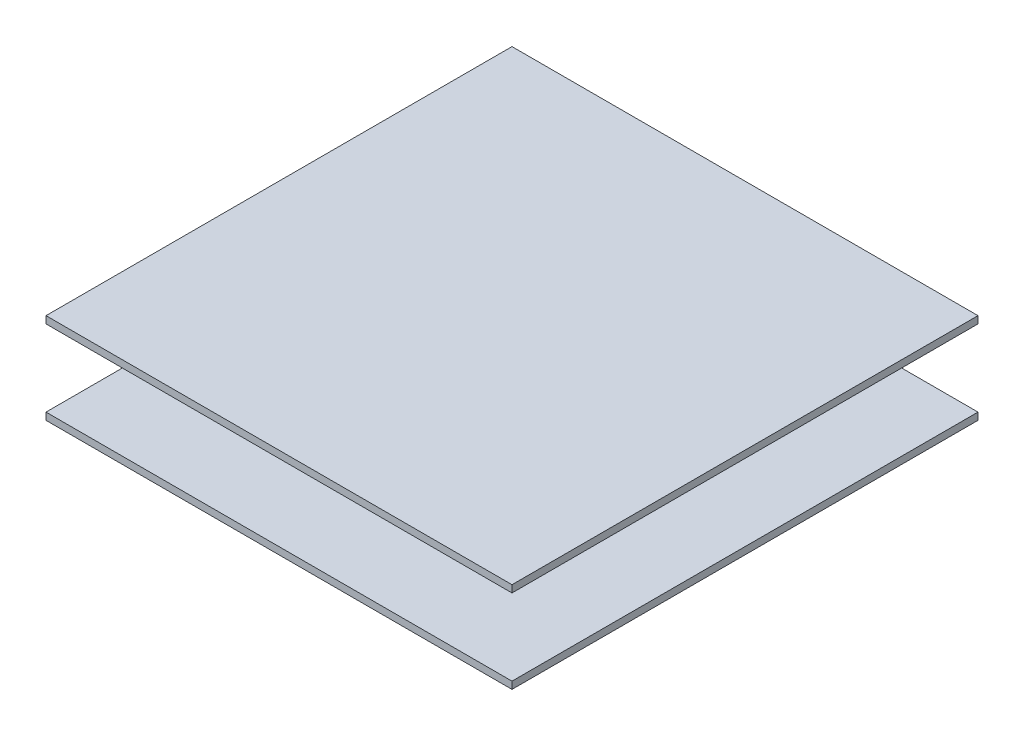
ISO-10303-21;
HEADER;
FILE_DESCRIPTION(('STEP AP214'),'2;1');
FILE_NAME('part.step','',(''),(''),'','','');
FILE_SCHEMA(('AUTOMOTIVE_DESIGN { 1 0 10303 214 1 1 1 1 }'));
ENDSEC;
DATA;
#1=APPLICATION_CONTEXT('core data for automotive mechanical design processes');
#2=APPLICATION_PROTOCOL_DEFINITION('international standard','automotive_design',2000,#1);
#3=PRODUCT_CONTEXT('',#1,'mechanical');
#4=PRODUCT('Part','Part','',(#3));
#5=PRODUCT_RELATED_PRODUCT_CATEGORY('part','',(#4));
#6=PRODUCT_DEFINITION_FORMATION('','',#4);
#7=PRODUCT_DEFINITION_CONTEXT('part definition',#1,'design');
#8=PRODUCT_DEFINITION('design','',#6,#7);
#9=PRODUCT_DEFINITION_SHAPE('','',#8);
#10=(LENGTH_UNIT() NAMED_UNIT(*) SI_UNIT(.MILLI.,.METRE.));
#11=(NAMED_UNIT(*) PLANE_ANGLE_UNIT() SI_UNIT($,.RADIAN.));
#12=(NAMED_UNIT(*) SI_UNIT($,.STERADIAN.) SOLID_ANGLE_UNIT());
#13=UNCERTAINTY_MEASURE_WITH_UNIT(LENGTH_MEASURE(1.E-05),#10,'distance_accuracy_value','');
#14=(GEOMETRIC_REPRESENTATION_CONTEXT(3) GLOBAL_UNCERTAINTY_ASSIGNED_CONTEXT((#13)) GLOBAL_UNIT_ASSIGNED_CONTEXT((#10,
#11,#12)) REPRESENTATION_CONTEXT('',''));
#15=CARTESIAN_POINT('',(0.,0.,0.));
#16=DIRECTION('',(0.,0.,1.));
#17=DIRECTION('',(1.,0.,0.));
#18=AXIS2_PLACEMENT_3D('',#15,#16,#17);
#19=CARTESIAN_POINT('',(0.,0.,80.));
#20=DIRECTION('',(1.,0.,0.));
#21=DIRECTION('',(0.,0.,-1.));
#22=AXIS2_PLACEMENT_3D('',#19,#20,#21);
#23=PLANE('',#22);
#24=CARTESIAN_POINT('',(0.,6.35,43.8));
#25=DIRECTION('',(-1.,0.,0.));
#26=DIRECTION('',(0.,0.,1.));
#27=AXIS2_PLACEMENT_3D('',#24,#25,#26);
#28=CIRCLE('',#27,5.25);
#29=CARTESIAN_POINT('',(0.,2.72750086266401,40.));
#30=VERTEX_POINT('',#29);
#31=CARTESIAN_POINT('',(0.,9.97249913733599,40.));
#32=VERTEX_POINT('',#31);
#33=EDGE_CURVE('E214',#30,#32,#28,.T.);
#34=ORIENTED_EDGE('',*,*,#33,.F.);
#35=CARTESIAN_POINT('',(0.,6.35,36.2));
#36=DIRECTION('',(-1.,0.,0.));
#37=DIRECTION('',(0.,0.,1.));
#38=AXIS2_PLACEMENT_3D('',#35,#36,#37);
#39=CIRCLE('',#38,5.25);
#40=EDGE_CURVE('E49',#32,#30,#39,.T.);
#41=ORIENTED_EDGE('',*,*,#40,.F.);
#42=EDGE_LOOP('',(#34,#41));
#43=FACE_BOUND('',#42,.T.);
#44=DIRECTION('',(0.,-1.,0.));
#45=VECTOR('',#44,1.);
#46=CARTESIAN_POINT('',(0.,0.,0.));
#47=LINE('',#46,#45);
#48=CARTESIAN_POINT('',(0.,12.7,0.));
#49=VERTEX_POINT('',#48);
#50=CARTESIAN_POINT('',(0.,0.,0.));
#51=VERTEX_POINT('',#50);
#52=EDGE_CURVE('E228',#49,#51,#47,.T.);
#53=ORIENTED_EDGE('',*,*,#52,.T.);
#54=DIRECTION('',(0.,0.,-1.));
#55=VECTOR('',#54,1.);
#56=CARTESIAN_POINT('',(0.,0.,80.));
#57=LINE('',#56,#55);
#58=CARTESIAN_POINT('',(0.,0.,80.));
#59=VERTEX_POINT('',#58);
#60=EDGE_CURVE('E11',#59,#51,#57,.T.);
#61=ORIENTED_EDGE('',*,*,#60,.F.);
#62=DIRECTION('',(0.,-1.,0.));
#63=VECTOR('',#62,1.);
#64=CARTESIAN_POINT('',(0.,0.,80.));
#65=LINE('',#64,#63);
#66=CARTESIAN_POINT('',(0.,12.7,80.));
#67=VERTEX_POINT('',#66);
#68=EDGE_CURVE('E231',#67,#59,#65,.T.);
#69=ORIENTED_EDGE('',*,*,#68,.F.);
#70=DIRECTION('',(0.,0.,-1.));
#71=VECTOR('',#70,1.);
#72=CARTESIAN_POINT('',(0.,12.7,80.));
#73=LINE('',#72,#71);
#74=EDGE_CURVE('E241',#67,#49,#73,.T.);
#75=ORIENTED_EDGE('',*,*,#74,.T.);
#76=EDGE_LOOP('',(#53,#61,#69,#75));
#77=FACE_BOUND('',#76,.T.);
#78=ADVANCED_FACE('F35',(#43,#77),#23,.F.);
#79=CARTESIAN_POINT('',(0.,0.,80.));
#80=DIRECTION('',(0.,1.,0.));
#81=DIRECTION('',(0.,0.,1.));
#82=AXIS2_PLACEMENT_3D('',#79,#80,#81);
#83=PLANE('',#82);
#84=CARTESIAN_POINT('',(6.6687205362473,0.,60.));
#85=DIRECTION('',(0.,1.,0.));
#86=DIRECTION('',(0.,0.,1.));
#87=AXIS2_PLACEMENT_3D('',#84,#85,#86);
#88=CIRCLE('',#87,2.);
#89=CARTESIAN_POINT('',(6.6687205362473,0.,62.));
#90=VERTEX_POINT('',#89);
#91=EDGE_CURVE('E197',#90,#90,#88,.T.);
#92=ORIENTED_EDGE('',*,*,#91,.T.);
#93=EDGE_LOOP('',(#92));
#94=FACE_BOUND('',#93,.T.);
#95=CARTESIAN_POINT('',(6.6687205362473,0.,75.));
#96=DIRECTION('',(0.,1.,0.));
#97=DIRECTION('',(0.,0.,1.));
#98=AXIS2_PLACEMENT_3D('',#95,#96,#97);
#99=CIRCLE('',#98,2.);
#100=CARTESIAN_POINT('',(6.6687205362473,0.,77.));
#101=VERTEX_POINT('',#100);
#102=EDGE_CURVE('E201',#101,#101,#99,.T.);
#103=ORIENTED_EDGE('',*,*,#102,.T.);
#104=EDGE_LOOP('',(#103));
#105=FACE_BOUND('',#104,.T.);
#106=DIRECTION('',(1.,0.,0.));
#107=VECTOR('',#106,1.);
#108=CARTESIAN_POINT('',(0.,0.,0.));
#109=LINE('',#108,#107);
#110=CARTESIAN_POINT('',(12.7,0.,0.));
#111=VERTEX_POINT('',#110);
#112=EDGE_CURVE('E244',#51,#111,#109,.T.);
#113=ORIENTED_EDGE('',*,*,#112,.T.);
#114=DIRECTION('',(0.,0.,-1.));
#115=VECTOR('',#114,1.);
#116=CARTESIAN_POINT('',(12.7,0.,80.));
#117=LINE('',#116,#115);
#118=CARTESIAN_POINT('',(12.7,0.,80.));
#119=VERTEX_POINT('',#118);
#120=EDGE_CURVE('E42',#119,#111,#117,.T.);
#121=ORIENTED_EDGE('',*,*,#120,.F.);
#122=DIRECTION('',(1.,0.,0.));
#123=VECTOR('',#122,1.);
#124=CARTESIAN_POINT('',(0.,0.,80.));
#125=LINE('',#124,#123);
#126=EDGE_CURVE('E234',#59,#119,#125,.T.);
#127=ORIENTED_EDGE('',*,*,#126,.F.);
#128=ORIENTED_EDGE('',*,*,#60,.T.);
#129=EDGE_LOOP('',(#113,#121,#127,#128));
#130=FACE_BOUND('',#129,.T.);
#131=ADVANCED_FACE('F274',(#94,#105,#130),#83,.F.);
#132=CARTESIAN_POINT('',(12.7,0.,80.));
#133=DIRECTION('',(-1.,0.,0.));
#134=DIRECTION('',(0.,0.,1.));
#135=AXIS2_PLACEMENT_3D('',#132,#133,#134);
#136=PLANE('',#135);
#137=CARTESIAN_POINT('',(12.7,6.35,43.8));
#138=DIRECTION('',(-1.,0.,0.));
#139=DIRECTION('',(0.,0.,1.));
#140=AXIS2_PLACEMENT_3D('',#137,#138,#139);
#141=CIRCLE('',#140,5.25);
#142=CARTESIAN_POINT('',(12.7,2.72750086266401,40.));
#143=VERTEX_POINT('',#142);
#144=CARTESIAN_POINT('',(12.7,9.97249913733599,40.));
#145=VERTEX_POINT('',#144);
#146=EDGE_CURVE('E213',#143,#145,#141,.T.);
#147=ORIENTED_EDGE('',*,*,#146,.T.);
#148=CARTESIAN_POINT('',(12.7,6.35,36.2));
#149=DIRECTION('',(-1.,0.,0.));
#150=DIRECTION('',(0.,0.,1.));
#151=AXIS2_PLACEMENT_3D('',#148,#149,#150);
#152=CIRCLE('',#151,5.25);
#153=EDGE_CURVE('E54',#145,#143,#152,.T.);
#154=ORIENTED_EDGE('',*,*,#153,.T.);
#155=EDGE_LOOP('',(#147,#154));
#156=FACE_BOUND('',#155,.T.);
#157=DIRECTION('',(0.,1.,0.));
#158=VECTOR('',#157,1.);
#159=CARTESIAN_POINT('',(12.7,0.,0.));
#160=LINE('',#159,#158);
#161=CARTESIAN_POINT('',(12.7,12.7,0.));
#162=VERTEX_POINT('',#161);
#163=EDGE_CURVE('E246',#111,#162,#160,.T.);
#164=ORIENTED_EDGE('',*,*,#163,.T.);
#165=DIRECTION('',(0.,0.,-1.));
#166=VECTOR('',#165,1.);
#167=CARTESIAN_POINT('',(12.7,12.7,80.));
#168=LINE('',#167,#166);
#169=CARTESIAN_POINT('',(12.7,12.7,80.));
#170=VERTEX_POINT('',#169);
#171=EDGE_CURVE('E251',#170,#162,#168,.T.);
#172=ORIENTED_EDGE('',*,*,#171,.F.);
#173=DIRECTION('',(0.,1.,0.));
#174=VECTOR('',#173,1.);
#175=CARTESIAN_POINT('',(12.7,0.,80.));
#176=LINE('',#175,#174);
#177=EDGE_CURVE('E237',#119,#170,#176,.T.);
#178=ORIENTED_EDGE('',*,*,#177,.F.);
#179=ORIENTED_EDGE('',*,*,#120,.T.);
#180=EDGE_LOOP('',(#164,#172,#178,#179));
#181=FACE_BOUND('',#180,.T.);
#182=ADVANCED_FACE('F258',(#156,#181),#136,.F.);
#183=CARTESIAN_POINT('',(0.,12.7,80.));
#184=DIRECTION('',(0.,-1.,0.));
#185=DIRECTION('',(0.,0.,-1.));
#186=AXIS2_PLACEMENT_3D('',#183,#184,#185);
#187=PLANE('',#186);
#188=CARTESIAN_POINT('',(6.6687205362473,12.7,5.));
#189=DIRECTION('',(0.,1.,0.));
#190=DIRECTION('',(0.,0.,1.));
#191=AXIS2_PLACEMENT_3D('',#188,#189,#190);
#192=CIRCLE('',#191,2.);
#193=CARTESIAN_POINT('',(6.6687205362473,12.7,7.));
#194=VERTEX_POINT('',#193);
#195=EDGE_CURVE('E225',#194,#194,#192,.T.);
#196=ORIENTED_EDGE('',*,*,#195,.F.);
#197=EDGE_LOOP('',(#196));
#198=FACE_BOUND('',#197,.T.);
#199=CARTESIAN_POINT('',(6.6687205362473,12.7,20.));
#200=DIRECTION('',(0.,1.,0.));
#201=DIRECTION('',(0.,0.,1.));
#202=AXIS2_PLACEMENT_3D('',#199,#200,#201);
#203=CIRCLE('',#202,2.);
#204=CARTESIAN_POINT('',(6.6687205362473,12.7,22.));
#205=VERTEX_POINT('',#204);
#206=EDGE_CURVE('E223',#205,#205,#203,.T.);
#207=ORIENTED_EDGE('',*,*,#206,.F.);
#208=EDGE_LOOP('',(#207));
#209=FACE_BOUND('',#208,.T.);
#210=DIRECTION('',(-1.,0.,0.));
#211=VECTOR('',#210,1.);
#212=CARTESIAN_POINT('',(0.,12.7,0.));
#213=LINE('',#212,#211);
#214=EDGE_CURVE('E235',#162,#49,#213,.T.);
#215=ORIENTED_EDGE('',*,*,#214,.T.);
#216=ORIENTED_EDGE('',*,*,#74,.F.);
#217=DIRECTION('',(-1.,0.,0.));
#218=VECTOR('',#217,1.);
#219=CARTESIAN_POINT('',(0.,12.7,80.));
#220=LINE('',#219,#218);
#221=EDGE_CURVE('E239',#170,#67,#220,.T.);
#222=ORIENTED_EDGE('',*,*,#221,.F.);
#223=ORIENTED_EDGE('',*,*,#171,.T.);
#224=EDGE_LOOP('',(#215,#216,#222,#223));
#225=FACE_BOUND('',#224,.T.);
#226=ADVANCED_FACE('F267',(#198,#209,#225),#187,.F.);
#227=CARTESIAN_POINT('',(0.,0.,80.));
#228=DIRECTION('',(0.,0.,-1.));
#229=DIRECTION('',(-1.,0.,0.));
#230=AXIS2_PLACEMENT_3D('',#227,#228,#229);
#231=PLANE('',#230);
#232=ORIENTED_EDGE('',*,*,#68,.T.);
#233=ORIENTED_EDGE('',*,*,#126,.T.);
#234=ORIENTED_EDGE('',*,*,#177,.T.);
#235=ORIENTED_EDGE('',*,*,#221,.T.);
#236=EDGE_LOOP('',(#232,#233,#234,#235));
#237=FACE_BOUND('',#236,.T.);
#238=ADVANCED_FACE('F273',(#237),#231,.F.);
#239=CARTESIAN_POINT('',(0.,0.,0.));
#240=DIRECTION('',(0.,0.,-1.));
#241=DIRECTION('',(-1.,0.,0.));
#242=AXIS2_PLACEMENT_3D('',#239,#240,#241);
#243=PLANE('',#242);
#244=ORIENTED_EDGE('',*,*,#52,.F.);
#245=ORIENTED_EDGE('',*,*,#214,.F.);
#246=ORIENTED_EDGE('',*,*,#163,.F.);
#247=ORIENTED_EDGE('',*,*,#112,.F.);
#248=EDGE_LOOP('',(#244,#245,#246,#247));
#249=FACE_BOUND('',#248,.T.);
#250=ADVANCED_FACE('F264',(#249),#243,.T.);
#251=CARTESIAN_POINT('',(12.7,6.35,36.2));
#252=DIRECTION('',(-1.,0.,0.));
#253=DIRECTION('',(0.,0.,1.));
#254=AXIS2_PLACEMENT_3D('',#251,#252,#253);
#255=CYLINDRICAL_SURFACE('',#254,5.25);
#256=ORIENTED_EDGE('',*,*,#40,.T.);
#257=DIRECTION('',(-1.,0.,0.));
#258=VECTOR('',#257,1.);
#259=CARTESIAN_POINT('',(12.7,2.72750086266401,40.));
#260=LINE('',#259,#258);
#261=EDGE_CURVE('E217',#143,#30,#260,.T.);
#262=ORIENTED_EDGE('',*,*,#261,.F.);
#263=ORIENTED_EDGE('',*,*,#153,.F.);
#264=DIRECTION('',(-1.,0.,0.));
#265=VECTOR('',#264,1.);
#266=CARTESIAN_POINT('',(12.7,9.97249913733599,40.));
#267=LINE('',#266,#265);
#268=EDGE_CURVE('E221',#145,#32,#267,.T.);
#269=ORIENTED_EDGE('',*,*,#268,.T.);
#270=EDGE_LOOP('',(#256,#262,#263,#269));
#271=FACE_BOUND('',#270,.T.);
#272=ADVANCED_FACE('F292',(#271),#255,.F.);
#273=CARTESIAN_POINT('',(12.7,6.35,43.8));
#274=DIRECTION('',(-1.,0.,0.));
#275=DIRECTION('',(0.,0.,1.));
#276=AXIS2_PLACEMENT_3D('',#273,#274,#275);
#277=CYLINDRICAL_SURFACE('',#276,5.25);
#278=ORIENTED_EDGE('',*,*,#33,.T.);
#279=ORIENTED_EDGE('',*,*,#268,.F.);
#280=ORIENTED_EDGE('',*,*,#146,.F.);
#281=ORIENTED_EDGE('',*,*,#261,.T.);
#282=EDGE_LOOP('',(#278,#279,#280,#281));
#283=FACE_BOUND('',#282,.T.);
#284=ADVANCED_FACE('F297',(#283),#277,.F.);
#285=CARTESIAN_POINT('',(6.6687205362473,17.,20.));
#286=DIRECTION('',(0.,-1.,0.));
#287=DIRECTION('',(0.,0.,-1.));
#288=AXIS2_PLACEMENT_3D('',#285,#286,#287);
#289=CYLINDRICAL_SURFACE('',#288,2.);
#290=CARTESIAN_POINT('',(6.6687205362473,17.,20.));
#291=DIRECTION('',(0.,1.,0.));
#292=DIRECTION('',(0.,0.,1.));
#293=AXIS2_PLACEMENT_3D('',#290,#291,#292);
#294=CIRCLE('',#293,2.);
#295=CARTESIAN_POINT('',(6.6687205362473,17.,22.));
#296=VERTEX_POINT('',#295);
#297=EDGE_CURVE('E209',#296,#296,#294,.T.);
#298=ORIENTED_EDGE('',*,*,#297,.F.);
#299=EDGE_LOOP('',(#298));
#300=FACE_BOUND('',#299,.T.);
#301=ORIENTED_EDGE('',*,*,#206,.T.);
#302=EDGE_LOOP('',(#301));
#303=FACE_BOUND('',#302,.T.);
#304=ADVANCED_FACE('F299',(#300,#303),#289,.T.);
#305=CARTESIAN_POINT('',(6.6687205362473,17.,5.));
#306=DIRECTION('',(0.,-1.,0.));
#307=DIRECTION('',(0.,0.,-1.));
#308=AXIS2_PLACEMENT_3D('',#305,#306,#307);
#309=CYLINDRICAL_SURFACE('',#308,2.);
#310=CARTESIAN_POINT('',(6.6687205362473,17.,5.));
#311=DIRECTION('',(0.,1.,0.));
#312=DIRECTION('',(0.,0.,1.));
#313=AXIS2_PLACEMENT_3D('',#310,#311,#312);
#314=CIRCLE('',#313,2.);
#315=CARTESIAN_POINT('',(6.6687205362473,17.,7.));
#316=VERTEX_POINT('',#315);
#317=EDGE_CURVE('E206',#316,#316,#314,.T.);
#318=ORIENTED_EDGE('',*,*,#317,.F.);
#319=EDGE_LOOP('',(#318));
#320=FACE_BOUND('',#319,.T.);
#321=ORIENTED_EDGE('',*,*,#195,.T.);
#322=EDGE_LOOP('',(#321));
#323=FACE_BOUND('',#322,.T.);
#324=ADVANCED_FACE('F303',(#320,#323),#309,.T.);
#325=CARTESIAN_POINT('',(6.6687205362473,-4.3,75.));
#326=DIRECTION('',(0.,1.,0.));
#327=DIRECTION('',(0.,0.,1.));
#328=AXIS2_PLACEMENT_3D('',#325,#326,#327);
#329=CYLINDRICAL_SURFACE('',#328,2.);
#330=CARTESIAN_POINT('',(6.6687205362473,-4.3,75.));
#331=DIRECTION('',(0.,1.,0.));
#332=DIRECTION('',(0.,0.,1.));
#333=AXIS2_PLACEMENT_3D('',#330,#331,#332);
#334=CIRCLE('',#333,2.);
#335=CARTESIAN_POINT('',(6.6687205362473,-4.3,77.));
#336=VERTEX_POINT('',#335);
#337=EDGE_CURVE('E162',#336,#336,#334,.T.);
#338=ORIENTED_EDGE('',*,*,#337,.T.);
#339=EDGE_LOOP('',(#338));
#340=FACE_BOUND('',#339,.T.);
#341=ORIENTED_EDGE('',*,*,#102,.F.);
#342=EDGE_LOOP('',(#341));
#343=FACE_BOUND('',#342,.T.);
#344=ADVANCED_FACE('F307',(#340,#343),#329,.T.);
#345=CARTESIAN_POINT('',(6.6687205362473,-4.3,60.));
#346=DIRECTION('',(0.,1.,0.));
#347=DIRECTION('',(0.,0.,1.));
#348=AXIS2_PLACEMENT_3D('',#345,#346,#347);
#349=CYLINDRICAL_SURFACE('',#348,2.);
#350=CARTESIAN_POINT('',(6.6687205362473,-4.3,60.));
#351=DIRECTION('',(0.,1.,0.));
#352=DIRECTION('',(0.,0.,1.));
#353=AXIS2_PLACEMENT_3D('',#350,#351,#352);
#354=CIRCLE('',#353,2.);
#355=CARTESIAN_POINT('',(6.6687205362473,-4.3,62.));
#356=VERTEX_POINT('',#355);
#357=EDGE_CURVE('E159',#356,#356,#354,.T.);
#358=ORIENTED_EDGE('',*,*,#357,.T.);
#359=EDGE_LOOP('',(#358));
#360=FACE_BOUND('',#359,.T.);
#361=ORIENTED_EDGE('',*,*,#91,.F.);
#362=EDGE_LOOP('',(#361));
#363=FACE_BOUND('',#362,.T.);
#364=ADVANCED_FACE('F311',(#360,#363),#349,.T.);
#365=CARTESIAN_POINT('',(-58.65,19.,105.));
#366=DIRECTION('',(1.,0.,0.));
#367=DIRECTION('',(0.,0.,-1.));
#368=AXIS2_PLACEMENT_3D('',#365,#366,#367);
#369=PLANE('',#368);
#370=DIRECTION('',(0.,0.,1.));
#371=VECTOR('',#370,1.);
#372=CARTESIAN_POINT('',(-58.65,17.,105.));
#373=LINE('',#372,#371);
#374=CARTESIAN_POINT('',(-58.65,17.,-25.));
#375=VERTEX_POINT('',#374);
#376=CARTESIAN_POINT('',(-58.65,17.,105.));
#377=VERTEX_POINT('',#376);
#378=EDGE_CURVE('E179',#375,#377,#373,.T.);
#379=ORIENTED_EDGE('',*,*,#378,.T.);
#380=DIRECTION('',(0.,-1.,0.));
#381=VECTOR('',#380,1.);
#382=CARTESIAN_POINT('',(-58.65,19.,105.));
#383=LINE('',#382,#381);
#384=CARTESIAN_POINT('',(-58.65,19.,105.));
#385=VERTEX_POINT('',#384);
#386=EDGE_CURVE('E195',#385,#377,#383,.T.);
#387=ORIENTED_EDGE('',*,*,#386,.F.);
#388=DIRECTION('',(0.,0.,1.));
#389=VECTOR('',#388,1.);
#390=CARTESIAN_POINT('',(-58.65,19.,105.));
#391=LINE('',#390,#389);
#392=CARTESIAN_POINT('',(-58.65,19.,-25.));
#393=VERTEX_POINT('',#392);
#394=EDGE_CURVE('E168',#393,#385,#391,.T.);
#395=ORIENTED_EDGE('',*,*,#394,.F.);
#396=DIRECTION('',(0.,-1.,0.));
#397=VECTOR('',#396,1.);
#398=CARTESIAN_POINT('',(-58.65,19.,-25.));
#399=LINE('',#398,#397);
#400=EDGE_CURVE('E178',#393,#375,#399,.T.);
#401=ORIENTED_EDGE('',*,*,#400,.T.);
#402=EDGE_LOOP('',(#379,#387,#395,#401));
#403=FACE_BOUND('',#402,.T.);
#404=ADVANCED_FACE('F315',(#403),#369,.F.);
#405=CARTESIAN_POINT('',(-58.65,19.,105.));
#406=DIRECTION('',(0.,0.,-1.));
#407=DIRECTION('',(-1.,0.,0.));
#408=AXIS2_PLACEMENT_3D('',#405,#406,#407);
#409=PLANE('',#408);
#410=DIRECTION('',(1.,0.,0.));
#411=VECTOR('',#410,1.);
#412=CARTESIAN_POINT('',(-58.65,17.,105.));
#413=LINE('',#412,#411);
#414=CARTESIAN_POINT('',(71.35,17.,105.));
#415=VERTEX_POINT('',#414);
#416=EDGE_CURVE('E182',#377,#415,#413,.T.);
#417=ORIENTED_EDGE('',*,*,#416,.T.);
#418=DIRECTION('',(0.,-1.,0.));
#419=VECTOR('',#418,1.);
#420=CARTESIAN_POINT('',(71.35,19.,105.));
#421=LINE('',#420,#419);
#422=CARTESIAN_POINT('',(71.35,19.,105.));
#423=VERTEX_POINT('',#422);
#424=EDGE_CURVE('E192',#423,#415,#421,.T.);
#425=ORIENTED_EDGE('',*,*,#424,.F.);
#426=DIRECTION('',(1.,0.,0.));
#427=VECTOR('',#426,1.);
#428=CARTESIAN_POINT('',(-58.65,19.,105.));
#429=LINE('',#428,#427);
#430=EDGE_CURVE('E171',#385,#423,#429,.T.);
#431=ORIENTED_EDGE('',*,*,#430,.F.);
#432=ORIENTED_EDGE('',*,*,#386,.T.);
#433=EDGE_LOOP('',(#417,#425,#431,#432));
#434=FACE_BOUND('',#433,.T.);
#435=ADVANCED_FACE('F319',(#434),#409,.F.);
#436=CARTESIAN_POINT('',(71.35,19.,105.));
#437=DIRECTION('',(-1.,0.,0.));
#438=DIRECTION('',(0.,0.,1.));
#439=AXIS2_PLACEMENT_3D('',#436,#437,#438);
#440=PLANE('',#439);
#441=DIRECTION('',(0.,0.,-1.));
#442=VECTOR('',#441,1.);
#443=CARTESIAN_POINT('',(71.35,17.,105.));
#444=LINE('',#443,#442);
#445=CARTESIAN_POINT('',(71.35,17.,-25.));
#446=VERTEX_POINT('',#445);
#447=EDGE_CURVE('E184',#415,#446,#444,.T.);
#448=ORIENTED_EDGE('',*,*,#447,.T.);
#449=DIRECTION('',(0.,-1.,0.));
#450=VECTOR('',#449,1.);
#451=CARTESIAN_POINT('',(71.35,19.,-25.));
#452=LINE('',#451,#450);
#453=CARTESIAN_POINT('',(71.35,19.,-25.));
#454=VERTEX_POINT('',#453);
#455=EDGE_CURVE('E189',#454,#446,#452,.T.);
#456=ORIENTED_EDGE('',*,*,#455,.F.);
#457=DIRECTION('',(0.,0.,-1.));
#458=VECTOR('',#457,1.);
#459=CARTESIAN_POINT('',(71.35,19.,105.));
#460=LINE('',#459,#458);
#461=EDGE_CURVE('E174',#423,#454,#460,.T.);
#462=ORIENTED_EDGE('',*,*,#461,.F.);
#463=ORIENTED_EDGE('',*,*,#424,.T.);
#464=EDGE_LOOP('',(#448,#456,#462,#463));
#465=FACE_BOUND('',#464,.T.);
#466=ADVANCED_FACE('F323',(#465),#440,.F.);
#467=CARTESIAN_POINT('',(-58.65,19.,-25.));
#468=DIRECTION('',(0.,0.,1.));
#469=DIRECTION('',(1.,0.,0.));
#470=AXIS2_PLACEMENT_3D('',#467,#468,#469);
#471=PLANE('',#470);
#472=DIRECTION('',(-1.,0.,0.));
#473=VECTOR('',#472,1.);
#474=CARTESIAN_POINT('',(-58.65,17.,-25.));
#475=LINE('',#474,#473);
#476=EDGE_CURVE('E172',#446,#375,#475,.T.);
#477=ORIENTED_EDGE('',*,*,#476,.T.);
#478=ORIENTED_EDGE('',*,*,#400,.F.);
#479=DIRECTION('',(-1.,0.,0.));
#480=VECTOR('',#479,1.);
#481=CARTESIAN_POINT('',(-58.65,19.,-25.));
#482=LINE('',#481,#480);
#483=EDGE_CURVE('E176',#454,#393,#482,.T.);
#484=ORIENTED_EDGE('',*,*,#483,.F.);
#485=ORIENTED_EDGE('',*,*,#455,.T.);
#486=EDGE_LOOP('',(#477,#478,#484,#485));
#487=FACE_BOUND('',#486,.T.);
#488=ADVANCED_FACE('F327',(#487),#471,.F.);
#489=CARTESIAN_POINT('',(0.,19.,0.));
#490=DIRECTION('',(0.,-1.,0.));
#491=DIRECTION('',(0.,0.,-1.));
#492=AXIS2_PLACEMENT_3D('',#489,#490,#491);
#493=PLANE('',#492);
#494=ORIENTED_EDGE('',*,*,#394,.T.);
#495=ORIENTED_EDGE('',*,*,#430,.T.);
#496=ORIENTED_EDGE('',*,*,#461,.T.);
#497=ORIENTED_EDGE('',*,*,#483,.T.);
#498=EDGE_LOOP('',(#494,#495,#496,#497));
#499=FACE_BOUND('',#498,.T.);
#500=ADVANCED_FACE('F331',(#499),#493,.F.);
#501=CARTESIAN_POINT('',(0.,17.,0.));
#502=DIRECTION('',(0.,-1.,0.));
#503=DIRECTION('',(0.,0.,-1.));
#504=AXIS2_PLACEMENT_3D('',#501,#502,#503);
#505=PLANE('',#504);
#506=ORIENTED_EDGE('',*,*,#297,.T.);
#507=EDGE_LOOP('',(#506));
#508=FACE_BOUND('',#507,.T.);
#509=ORIENTED_EDGE('',*,*,#317,.T.);
#510=EDGE_LOOP('',(#509));
#511=FACE_BOUND('',#510,.T.);
#512=ORIENTED_EDGE('',*,*,#378,.F.);
#513=ORIENTED_EDGE('',*,*,#476,.F.);
#514=ORIENTED_EDGE('',*,*,#447,.F.);
#515=ORIENTED_EDGE('',*,*,#416,.F.);
#516=EDGE_LOOP('',(#512,#513,#514,#515));
#517=FACE_BOUND('',#516,.T.);
#518=ADVANCED_FACE('F333',(#508,#511,#517),#505,.T.);
#519=CARTESIAN_POINT('',(71.35,-6.3,105.));
#520=DIRECTION('',(0.,0.,-1.));
#521=DIRECTION('',(-1.,0.,0.));
#522=AXIS2_PLACEMENT_3D('',#519,#520,#521);
#523=PLANE('',#522);
#524=DIRECTION('',(-1.,0.,0.));
#525=VECTOR('',#524,1.);
#526=CARTESIAN_POINT('',(71.35,-4.3,105.));
#527=LINE('',#526,#525);
#528=CARTESIAN_POINT('',(71.35,-4.3,105.));
#529=VERTEX_POINT('',#528);
#530=CARTESIAN_POINT('',(-58.65,-4.3,105.));
#531=VERTEX_POINT('',#530);
#532=EDGE_CURVE('E158',#529,#531,#527,.T.);
#533=ORIENTED_EDGE('',*,*,#532,.T.);
#534=DIRECTION('',(0.,1.,0.));
#535=VECTOR('',#534,1.);
#536=CARTESIAN_POINT('',(-58.65,-6.3,105.));
#537=LINE('',#536,#535);
#538=CARTESIAN_POINT('',(-58.65,-6.3,105.));
#539=VERTEX_POINT('',#538);
#540=EDGE_CURVE('E138',#539,#531,#537,.T.);
#541=ORIENTED_EDGE('',*,*,#540,.F.);
#542=DIRECTION('',(-1.,0.,0.));
#543=VECTOR('',#542,1.);
#544=CARTESIAN_POINT('',(71.35,-6.3,105.));
#545=LINE('',#544,#543);
#546=CARTESIAN_POINT('',(71.35,-6.3,105.));
#547=VERTEX_POINT('',#546);
#548=EDGE_CURVE('E145',#547,#539,#545,.T.);
#549=ORIENTED_EDGE('',*,*,#548,.F.);
#550=DIRECTION('',(0.,1.,0.));
#551=VECTOR('',#550,1.);
#552=CARTESIAN_POINT('',(71.35,-6.3,105.));
#553=LINE('',#552,#551);
#554=EDGE_CURVE('E526',#547,#529,#553,.T.);
#555=ORIENTED_EDGE('',*,*,#554,.T.);
#556=EDGE_LOOP('',(#533,#541,#549,#555));
#557=FACE_BOUND('',#556,.T.);
#558=ADVANCED_FACE('F156',(#557),#523,.F.);
#559=CARTESIAN_POINT('',(-58.65,-6.3,105.));
#560=DIRECTION('',(1.,0.,0.));
#561=DIRECTION('',(0.,0.,-1.));
#562=AXIS2_PLACEMENT_3D('',#559,#560,#561);
#563=PLANE('',#562);
#564=DIRECTION('',(0.,0.,-1.));
#565=VECTOR('',#564,1.);
#566=CARTESIAN_POINT('',(-58.65,-4.3,105.));
#567=LINE('',#566,#565);
#568=CARTESIAN_POINT('',(-58.65,-4.3,-25.));
#569=VERTEX_POINT('',#568);
#570=EDGE_CURVE('E517',#531,#569,#567,.T.);
#571=ORIENTED_EDGE('',*,*,#570,.T.);
#572=DIRECTION('',(0.,1.,0.));
#573=VECTOR('',#572,1.);
#574=CARTESIAN_POINT('',(-58.65,-6.3,-25.));
#575=LINE('',#574,#573);
#576=CARTESIAN_POINT('',(-58.65,-6.3,-25.));
#577=VERTEX_POINT('',#576);
#578=EDGE_CURVE('E141',#577,#569,#575,.T.);
#579=ORIENTED_EDGE('',*,*,#578,.F.);
#580=DIRECTION('',(0.,0.,-1.));
#581=VECTOR('',#580,1.);
#582=CARTESIAN_POINT('',(-58.65,-6.3,105.));
#583=LINE('',#582,#581);
#584=EDGE_CURVE('E134',#539,#577,#583,.T.);
#585=ORIENTED_EDGE('',*,*,#584,.F.);
#586=ORIENTED_EDGE('',*,*,#540,.T.);
#587=EDGE_LOOP('',(#571,#579,#585,#586));
#588=FACE_BOUND('',#587,.T.);
#589=ADVANCED_FACE('F136',(#588),#563,.F.);
#590=CARTESIAN_POINT('',(-58.65,-6.3,-25.));
#591=DIRECTION('',(0.,0.,1.));
#592=DIRECTION('',(1.,0.,0.));
#593=AXIS2_PLACEMENT_3D('',#590,#591,#592);
#594=PLANE('',#593);
#595=DIRECTION('',(1.,0.,0.));
#596=VECTOR('',#595,1.);
#597=CARTESIAN_POINT('',(-58.65,-4.3,-25.));
#598=LINE('',#597,#596);
#599=CARTESIAN_POINT('',(71.35,-4.3,-25.));
#600=VERTEX_POINT('',#599);
#601=EDGE_CURVE('E519',#569,#600,#598,.T.);
#602=ORIENTED_EDGE('',*,*,#601,.T.);
#603=DIRECTION('',(0.,1.,0.));
#604=VECTOR('',#603,1.);
#605=CARTESIAN_POINT('',(71.35,-6.3,-25.));
#606=LINE('',#605,#604);
#607=CARTESIAN_POINT('',(71.35,-6.3,-25.));
#608=VERTEX_POINT('',#607);
#609=EDGE_CURVE('E164',#608,#600,#606,.T.);
#610=ORIENTED_EDGE('',*,*,#609,.F.);
#611=DIRECTION('',(1.,0.,0.));
#612=VECTOR('',#611,1.);
#613=CARTESIAN_POINT('',(-58.65,-6.3,-25.));
#614=LINE('',#613,#612);
#615=EDGE_CURVE('E144',#577,#608,#614,.T.);
#616=ORIENTED_EDGE('',*,*,#615,.F.);
#617=ORIENTED_EDGE('',*,*,#578,.T.);
#618=EDGE_LOOP('',(#602,#610,#616,#617));
#619=FACE_BOUND('',#618,.T.);
#620=ADVANCED_FACE('F344',(#619),#594,.F.);
#621=CARTESIAN_POINT('',(71.35,-6.3,-25.));
#622=DIRECTION('',(-1.,0.,0.));
#623=DIRECTION('',(0.,0.,1.));
#624=AXIS2_PLACEMENT_3D('',#621,#622,#623);
#625=PLANE('',#624);
#626=DIRECTION('',(0.,0.,1.));
#627=VECTOR('',#626,1.);
#628=CARTESIAN_POINT('',(71.35,-4.3,-25.));
#629=LINE('',#628,#627);
#630=EDGE_CURVE('E154',#600,#529,#629,.T.);
#631=ORIENTED_EDGE('',*,*,#630,.T.);
#632=ORIENTED_EDGE('',*,*,#554,.F.);
#633=DIRECTION('',(0.,0.,1.));
#634=VECTOR('',#633,1.);
#635=CARTESIAN_POINT('',(71.35,-6.3,-25.));
#636=LINE('',#635,#634);
#637=EDGE_CURVE('E150',#608,#547,#636,.T.);
#638=ORIENTED_EDGE('',*,*,#637,.F.);
#639=ORIENTED_EDGE('',*,*,#609,.T.);
#640=EDGE_LOOP('',(#631,#632,#638,#639));
#641=FACE_BOUND('',#640,.T.);
#642=ADVANCED_FACE('F347',(#641),#625,.F.);
#643=CARTESIAN_POINT('',(0.,-6.3,0.));
#644=DIRECTION('',(0.,-1.,0.));
#645=DIRECTION('',(0.,0.,-1.));
#646=AXIS2_PLACEMENT_3D('',#643,#644,#645);
#647=PLANE('',#646);
#648=ORIENTED_EDGE('',*,*,#548,.T.);
#649=ORIENTED_EDGE('',*,*,#584,.T.);
#650=ORIENTED_EDGE('',*,*,#615,.T.);
#651=ORIENTED_EDGE('',*,*,#637,.T.);
#652=EDGE_LOOP('',(#648,#649,#650,#651));
#653=FACE_BOUND('',#652,.T.);
#654=ADVANCED_FACE('F148',(#653),#647,.T.);
#655=CARTESIAN_POINT('',(0.,-4.3,0.));
#656=DIRECTION('',(0.,-1.,0.));
#657=DIRECTION('',(0.,0.,-1.));
#658=AXIS2_PLACEMENT_3D('',#655,#656,#657);
#659=PLANE('',#658);
#660=ORIENTED_EDGE('',*,*,#337,.F.);
#661=EDGE_LOOP('',(#660));
#662=FACE_BOUND('',#661,.T.);
#663=ORIENTED_EDGE('',*,*,#357,.F.);
#664=EDGE_LOOP('',(#663));
#665=FACE_BOUND('',#664,.T.);
#666=ORIENTED_EDGE('',*,*,#532,.F.);
#667=ORIENTED_EDGE('',*,*,#630,.F.);
#668=ORIENTED_EDGE('',*,*,#601,.F.);
#669=ORIENTED_EDGE('',*,*,#570,.F.);
#670=EDGE_LOOP('',(#666,#667,#668,#669));
#671=FACE_BOUND('',#670,.T.);
#672=ADVANCED_FACE('F352',(#662,#665,#671),#659,.F.);
#673=CLOSED_SHELL('',(#78,#131,#182,#226,#238,#250,#272,#284,#304,#324,#344,#364,#404,#435,#466,
#488,#500,#518,#558,#589,#620,#642,#654,#672));
#674=MANIFOLD_SOLID_BREP('B2',#673);
#675=ADVANCED_BREP_SHAPE_REPRESENTATION('',(#18,#674),#14);
#676=SHAPE_DEFINITION_REPRESENTATION(#9,#675);
ENDSEC;
END-ISO-10303-21;
